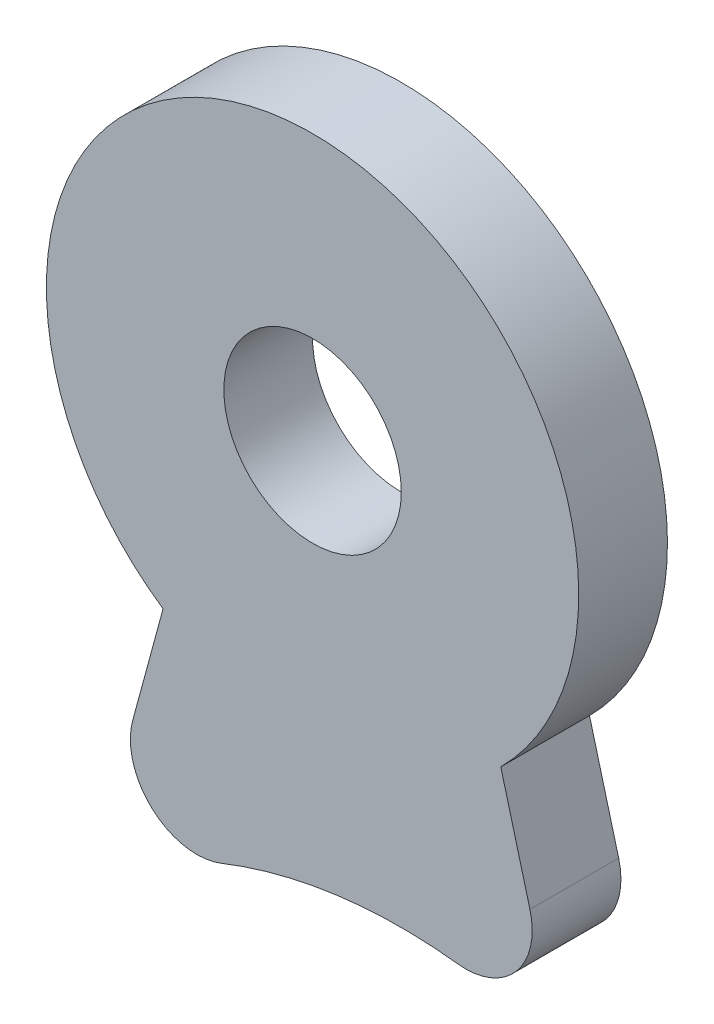
ISO-10303-21;
HEADER;
FILE_DESCRIPTION(('STEP AP214'),'2;1');
FILE_NAME('part.step','',(''),(''),'','','');
FILE_SCHEMA(('AUTOMOTIVE_DESIGN { 1 0 10303 214 1 1 1 1 }'));
ENDSEC;
DATA;
#1=APPLICATION_CONTEXT('core data for automotive mechanical design processes');
#2=APPLICATION_PROTOCOL_DEFINITION('international standard','automotive_design',2000,#1);
#3=PRODUCT_CONTEXT('',#1,'mechanical');
#4=PRODUCT('Part','Part','',(#3));
#5=PRODUCT_RELATED_PRODUCT_CATEGORY('part','',(#4));
#6=PRODUCT_DEFINITION_FORMATION('','',#4);
#7=PRODUCT_DEFINITION_CONTEXT('part definition',#1,'design');
#8=PRODUCT_DEFINITION('design','',#6,#7);
#9=PRODUCT_DEFINITION_SHAPE('','',#8);
#10=(LENGTH_UNIT() NAMED_UNIT(*) SI_UNIT(.MILLI.,.METRE.));
#11=(NAMED_UNIT(*) PLANE_ANGLE_UNIT() SI_UNIT($,.RADIAN.));
#12=(NAMED_UNIT(*) SI_UNIT($,.STERADIAN.) SOLID_ANGLE_UNIT());
#13=UNCERTAINTY_MEASURE_WITH_UNIT(LENGTH_MEASURE(1.E-05),#10,'distance_accuracy_value','');
#14=(GEOMETRIC_REPRESENTATION_CONTEXT(3) GLOBAL_UNCERTAINTY_ASSIGNED_CONTEXT((#13)) GLOBAL_UNIT_ASSIGNED_CONTEXT((#10,
#11,#12)) REPRESENTATION_CONTEXT('',''));
#15=CARTESIAN_POINT('',(0.,0.,0.));
#16=DIRECTION('',(0.,0.,1.));
#17=DIRECTION('',(1.,0.,0.));
#18=AXIS2_PLACEMENT_3D('',#15,#16,#17);
#19=CARTESIAN_POINT('',(-174.416251328011,-25.1721603850015,2.));
#20=DIRECTION('',(0.,0.,-1.));
#21=DIRECTION('',(-1.,0.,0.));
#22=AXIS2_PLACEMENT_3D('',#19,#20,#21);
#23=CYLINDRICAL_SURFACE('',#22,6.00000000000002);
#24=CARTESIAN_POINT('',(-174.416251328011,-25.1721603850015,0.));
#25=DIRECTION('',(0.,0.,1.));
#26=DIRECTION('',(1.,0.,0.));
#27=AXIS2_PLACEMENT_3D('',#24,#25,#26);
#28=CIRCLE('',#27,6.00000000000002);
#29=CARTESIAN_POINT('',(-170.173610641153,-29.4148010723819,0.));
#30=VERTEX_POINT('',#29);
#31=CARTESIAN_POINT('',(-177.78627055048,-30.1363290404956,0.));
#32=VERTEX_POINT('',#31);
#33=EDGE_CURVE('E106',#30,#32,#28,.T.);
#34=ORIENTED_EDGE('',*,*,#33,.T.);
#35=DIRECTION('',(0.,0.,-1.));
#36=VECTOR('',#35,1.);
#37=CARTESIAN_POINT('',(-177.78627055048,-30.1363290404956,2.));
#38=LINE('',#37,#36);
#39=CARTESIAN_POINT('',(-177.78627055048,-30.1363290404956,2.));
#40=VERTEX_POINT('',#39);
#41=EDGE_CURVE('E93',#40,#32,#38,.T.);
#42=ORIENTED_EDGE('',*,*,#41,.F.);
#43=CARTESIAN_POINT('',(-174.416251328011,-25.1721603850015,2.));
#44=DIRECTION('',(0.,0.,1.));
#45=DIRECTION('',(1.,0.,0.));
#46=AXIS2_PLACEMENT_3D('',#43,#44,#45);
#47=CIRCLE('',#46,6.00000000000002);
#48=CARTESIAN_POINT('',(-170.173610641153,-29.4148010723819,2.));
#49=VERTEX_POINT('',#48);
#50=EDGE_CURVE('E97',#49,#40,#47,.T.);
#51=ORIENTED_EDGE('',*,*,#50,.F.);
#52=DIRECTION('',(0.,0.,-1.));
#53=VECTOR('',#52,1.);
#54=CARTESIAN_POINT('',(-170.173610641153,-29.4148010723819,2.));
#55=LINE('',#54,#53);
#56=EDGE_CURVE('E108',#49,#30,#55,.T.);
#57=ORIENTED_EDGE('',*,*,#56,.T.);
#58=EDGE_LOOP('',(#34,#42,#51,#57));
#59=FACE_BOUND('',#58,.T.);
#60=ADVANCED_FACE('F35',(#59),#23,.T.);
#61=CARTESIAN_POINT('',(-157.968634140736,42.8767622426203,2.));
#62=DIRECTION('',(0.96508195176001,-0.261948136826911,0.));
#63=DIRECTION('',(0.261948136826911,0.96508195176001,0.));
#64=AXIS2_PLACEMENT_3D('',#61,#62,#63);
#65=PLANE('',#64);
#66=DIRECTION('',(-0.261948136826911,-0.96508195176001,0.));
#67=VECTOR('',#66,1.);
#68=CARTESIAN_POINT('',(-157.968634140736,42.8767622426203,0.));
#69=LINE('',#68,#67);
#70=CARTESIAN_POINT('',(-178.471059683422,-32.6592621713409,0.));
#71=VERTEX_POINT('',#70);
#72=EDGE_CURVE('E134',#32,#71,#69,.T.);
#73=ORIENTED_EDGE('',*,*,#72,.T.);
#74=DIRECTION('',(0.,0.,-1.));
#75=VECTOR('',#74,1.);
#76=CARTESIAN_POINT('',(-178.471059683422,-32.6592621713409,2.));
#77=LINE('',#76,#75);
#78=CARTESIAN_POINT('',(-178.471059683422,-32.6592621713409,2.));
#79=VERTEX_POINT('',#78);
#80=EDGE_CURVE('E58',#71,#79,#77,.F.);
#81=ORIENTED_EDGE('',*,*,#80,.T.);
#82=DIRECTION('',(-0.261948136826911,-0.96508195176001,0.));
#83=VECTOR('',#82,1.);
#84=CARTESIAN_POINT('',(-157.968634140736,42.8767622426203,2.));
#85=LINE('',#84,#83);
#86=EDGE_CURVE('E89',#40,#79,#85,.T.);
#87=ORIENTED_EDGE('',*,*,#86,.F.);
#88=ORIENTED_EDGE('',*,*,#41,.T.);
#89=EDGE_LOOP('',(#73,#81,#87,#88));
#90=FACE_BOUND('',#89,.T.);
#91=ADVANCED_FACE('F91',(#90),#65,.F.);
#92=CARTESIAN_POINT('',(-172.416251329011,-44.6721603850015,2.));
#93=DIRECTION('',(0.,0.,-1.));
#94=DIRECTION('',(-1.,0.,0.));
#95=AXIS2_PLACEMENT_3D('',#92,#93,#94);
#96=CYLINDRICAL_SURFACE('',#95,10.9999999997165);
#97=CARTESIAN_POINT('',(-172.416251329011,-44.6721603850015,2.));
#98=DIRECTION('',(0.,0.,1.));
#99=DIRECTION('',(1.,0.,0.));
#100=AXIS2_PLACEMENT_3D('',#97,#98,#99);
#101=CIRCLE('',#100,10.9999999997165);
#102=CARTESIAN_POINT('',(-176.470574504557,-34.4465814976233,2.));
#103=VERTEX_POINT('',#102);
#104=CARTESIAN_POINT('',(-171.139188939347,-33.746543164603,2.));
#105=VERTEX_POINT('',#104);
#106=EDGE_CURVE('E96',#103,#105,#101,.F.);
#107=ORIENTED_EDGE('',*,*,#106,.F.);
#108=DIRECTION('',(0.,0.,-1.));
#109=VECTOR('',#108,1.);
#110=CARTESIAN_POINT('',(-176.470574504557,-34.4465814976233,2.));
#111=LINE('',#110,#109);
#112=CARTESIAN_POINT('',(-176.470574504557,-34.4465814976233,0.));
#113=VERTEX_POINT('',#112);
#114=EDGE_CURVE('E110',#103,#113,#111,.T.);
#115=ORIENTED_EDGE('',*,*,#114,.T.);
#116=CARTESIAN_POINT('',(-172.416251329011,-44.6721603850015,0.));
#117=DIRECTION('',(0.,0.,1.));
#118=DIRECTION('',(1.,0.,0.));
#119=AXIS2_PLACEMENT_3D('',#116,#117,#118);
#120=CIRCLE('',#119,10.9999999997165);
#121=CARTESIAN_POINT('',(-171.139188939347,-33.746543164603,0.));
#122=VERTEX_POINT('',#121);
#123=EDGE_CURVE('E135',#113,#122,#120,.F.);
#124=ORIENTED_EDGE('',*,*,#123,.T.);
#125=DIRECTION('',(0.,0.,-1.));
#126=VECTOR('',#125,1.);
#127=CARTESIAN_POINT('',(-171.139188939347,-33.746543164603,2.));
#128=LINE('',#127,#126);
#129=EDGE_CURVE('E107',#122,#105,#128,.F.);
#130=ORIENTED_EDGE('',*,*,#129,.T.);
#131=EDGE_LOOP('',(#107,#115,#124,#130));
#132=FACE_BOUND('',#131,.T.);
#133=ADVANCED_FACE('F126',(#132),#96,.F.);
#134=CARTESIAN_POINT('',(-174.416251328011,-25.1721603850015,2.));
#135=DIRECTION('',(0.,0.,-1.));
#136=DIRECTION('',(-1.,0.,0.));
#137=AXIS2_PLACEMENT_3D('',#134,#135,#136);
#138=CYLINDRICAL_SURFACE('',#137,2.);
#139=CARTESIAN_POINT('',(-174.416251328011,-25.1721603850015,2.));
#140=DIRECTION('',(0.,0.,1.));
#141=DIRECTION('',(1.,0.,0.));
#142=AXIS2_PLACEMENT_3D('',#139,#140,#141);
#143=CIRCLE('',#142,2.);
#144=CARTESIAN_POINT('',(-172.416251328011,-25.1721603850015,2.));
#145=VERTEX_POINT('',#144);
#146=EDGE_CURVE('E103',#145,#145,#143,.T.);
#147=ORIENTED_EDGE('',*,*,#146,.T.);
#148=EDGE_LOOP('',(#147));
#149=FACE_BOUND('',#148,.T.);
#150=CARTESIAN_POINT('',(-174.416251328011,-25.1721603850015,0.));
#151=DIRECTION('',(0.,0.,1.));
#152=DIRECTION('',(1.,0.,0.));
#153=AXIS2_PLACEMENT_3D('',#150,#151,#152);
#154=CIRCLE('',#153,2.);
#155=CARTESIAN_POINT('',(-172.416251328011,-25.1721603850015,0.));
#156=VERTEX_POINT('',#155);
#157=EDGE_CURVE('E139',#156,#156,#154,.T.);
#158=ORIENTED_EDGE('',*,*,#157,.F.);
#159=EDGE_LOOP('',(#158));
#160=FACE_BOUND('',#159,.T.);
#161=ADVANCED_FACE('F153',(#149,#160),#138,.F.);
#162=CARTESIAN_POINT('',(-166.127840527117,-44.5138206977246,2.));
#163=DIRECTION('',(0.965925826306283,0.258819045038276,0.));
#164=DIRECTION('',(-0.258819045038276,0.965925826306283,0.));
#165=AXIS2_PLACEMENT_3D('',#162,#163,#164);
#166=PLANE('',#165);
#167=DIRECTION('',(0.258819045038276,-0.965925826306283,0.));
#168=VECTOR('',#167,1.);
#169=CARTESIAN_POINT('',(-166.127840527117,-44.5138206977246,2.));
#170=LINE('',#169,#168);
#171=CARTESIAN_POINT('',(-169.516155328565,-31.8684577033164,2.));
#172=VERTEX_POINT('',#171);
#173=EDGE_CURVE('E101',#49,#172,#170,.T.);
#174=ORIENTED_EDGE('',*,*,#173,.T.);
#175=DIRECTION('',(0.,0.,1.));
#176=VECTOR('',#175,1.);
#177=CARTESIAN_POINT('',(-169.516155328565,-31.8684577033164,0.));
#178=LINE('',#177,#176);
#179=CARTESIAN_POINT('',(-169.516155328565,-31.8684577033164,0.));
#180=VERTEX_POINT('',#179);
#181=EDGE_CURVE('E11',#172,#180,#178,.F.);
#182=ORIENTED_EDGE('',*,*,#181,.T.);
#183=DIRECTION('',(0.258819045038276,-0.965925826306283,0.));
#184=VECTOR('',#183,1.);
#185=CARTESIAN_POINT('',(-166.127840527117,-44.5138206977246,0.));
#186=LINE('',#185,#184);
#187=EDGE_CURVE('E137',#30,#180,#186,.T.);
#188=ORIENTED_EDGE('',*,*,#187,.F.);
#189=ORIENTED_EDGE('',*,*,#56,.F.);
#190=EDGE_LOOP('',(#174,#182,#188,#189));
#191=FACE_BOUND('',#190,.T.);
#192=ADVANCED_FACE('F155',(#191),#166,.T.);
#193=CARTESIAN_POINT('',(0.,0.,2.));
#194=DIRECTION('',(0.,0.,1.));
#195=DIRECTION('',(1.,0.,0.));
#196=AXIS2_PLACEMENT_3D('',#193,#194,#195);
#197=PLANE('',#196);
#198=ORIENTED_EDGE('',*,*,#146,.F.);
#199=EDGE_LOOP('',(#198));
#200=FACE_BOUND('',#199,.T.);
#201=ORIENTED_EDGE('',*,*,#86,.T.);
#202=CARTESIAN_POINT('',(-177.023436755782,-33.0521843765813,2.));
#203=DIRECTION('',(0.,0.,1.));
#204=DIRECTION('',(1.,0.,0.));
#205=AXIS2_PLACEMENT_3D('',#202,#203,#204);
#206=CIRCLE('',#205,1.5);
#207=EDGE_CURVE('E43',#79,#103,#206,.T.);
#208=ORIENTED_EDGE('',*,*,#207,.T.);
#209=ORIENTED_EDGE('',*,*,#106,.T.);
#210=CARTESIAN_POINT('',(-170.965044068025,-32.2566862708739,2.));
#211=DIRECTION('',(0.,0.,1.));
#212=DIRECTION('',(1.,0.,0.));
#213=AXIS2_PLACEMENT_3D('',#210,#211,#212);
#214=CIRCLE('',#213,1.5);
#215=EDGE_CURVE('E50',#105,#172,#214,.T.);
#216=ORIENTED_EDGE('',*,*,#215,.T.);
#217=ORIENTED_EDGE('',*,*,#173,.F.);
#218=ORIENTED_EDGE('',*,*,#50,.T.);
#219=EDGE_LOOP('',(#201,#208,#209,#216,#217,#218));
#220=FACE_BOUND('',#219,.T.);
#221=ADVANCED_FACE('F100',(#200,#220),#197,.T.);
#222=CARTESIAN_POINT('',(0.,0.,0.));
#223=DIRECTION('',(0.,0.,1.));
#224=DIRECTION('',(1.,0.,0.));
#225=AXIS2_PLACEMENT_3D('',#222,#223,#224);
#226=PLANE('',#225);
#227=ORIENTED_EDGE('',*,*,#157,.T.);
#228=EDGE_LOOP('',(#227));
#229=FACE_BOUND('',#228,.T.);
#230=ORIENTED_EDGE('',*,*,#123,.F.);
#231=CARTESIAN_POINT('',(-177.023436755782,-33.0521843765813,0.));
#232=DIRECTION('',(0.,0.,1.));
#233=DIRECTION('',(1.,0.,0.));
#234=AXIS2_PLACEMENT_3D('',#231,#232,#233);
#235=CIRCLE('',#234,1.5);
#236=EDGE_CURVE('E119',#113,#71,#235,.F.);
#237=ORIENTED_EDGE('',*,*,#236,.T.);
#238=ORIENTED_EDGE('',*,*,#72,.F.);
#239=ORIENTED_EDGE('',*,*,#33,.F.);
#240=ORIENTED_EDGE('',*,*,#187,.T.);
#241=CARTESIAN_POINT('',(-170.965044068025,-32.2566862708739,0.));
#242=DIRECTION('',(0.,0.,1.));
#243=DIRECTION('',(1.,0.,0.));
#244=AXIS2_PLACEMENT_3D('',#241,#242,#243);
#245=CIRCLE('',#244,1.5);
#246=EDGE_CURVE('E117',#180,#122,#245,.F.);
#247=ORIENTED_EDGE('',*,*,#246,.T.);
#248=EDGE_LOOP('',(#230,#237,#238,#239,#240,#247));
#249=FACE_BOUND('',#248,.T.);
#250=ADVANCED_FACE('F133',(#229,#249),#226,.F.);
#251=CARTESIAN_POINT('',(-177.023436755782,-33.0521843765813,2.));
#252=DIRECTION('',(0.,0.,-1.));
#253=DIRECTION('',(-1.,0.,0.));
#254=AXIS2_PLACEMENT_3D('',#251,#252,#253);
#255=CYLINDRICAL_SURFACE('',#254,1.5);
#256=ORIENTED_EDGE('',*,*,#207,.F.);
#257=ORIENTED_EDGE('',*,*,#80,.F.);
#258=ORIENTED_EDGE('',*,*,#236,.F.);
#259=ORIENTED_EDGE('',*,*,#114,.F.);
#260=EDGE_LOOP('',(#256,#257,#258,#259));
#261=FACE_BOUND('',#260,.T.);
#262=ADVANCED_FACE('F131',(#261),#255,.T.);
#263=CARTESIAN_POINT('',(-170.965044068025,-32.2566862708739,2.));
#264=DIRECTION('',(0.,0.,-1.));
#265=DIRECTION('',(-1.,0.,0.));
#266=AXIS2_PLACEMENT_3D('',#263,#264,#265);
#267=CYLINDRICAL_SURFACE('',#266,1.5);
#268=ORIENTED_EDGE('',*,*,#215,.F.);
#269=ORIENTED_EDGE('',*,*,#129,.F.);
#270=ORIENTED_EDGE('',*,*,#246,.F.);
#271=ORIENTED_EDGE('',*,*,#181,.F.);
#272=EDGE_LOOP('',(#268,#269,#270,#271));
#273=FACE_BOUND('',#272,.T.);
#274=ADVANCED_FACE('F37',(#273),#267,.T.);
#275=CLOSED_SHELL('',(#60,#91,#133,#161,#192,#221,#250,#262,#274));
#276=MANIFOLD_SOLID_BREP('B2',#275);
#277=ADVANCED_BREP_SHAPE_REPRESENTATION('',(#18,#276),#14);
#278=SHAPE_DEFINITION_REPRESENTATION(#9,#277);
ENDSEC;
END-ISO-10303-21;
